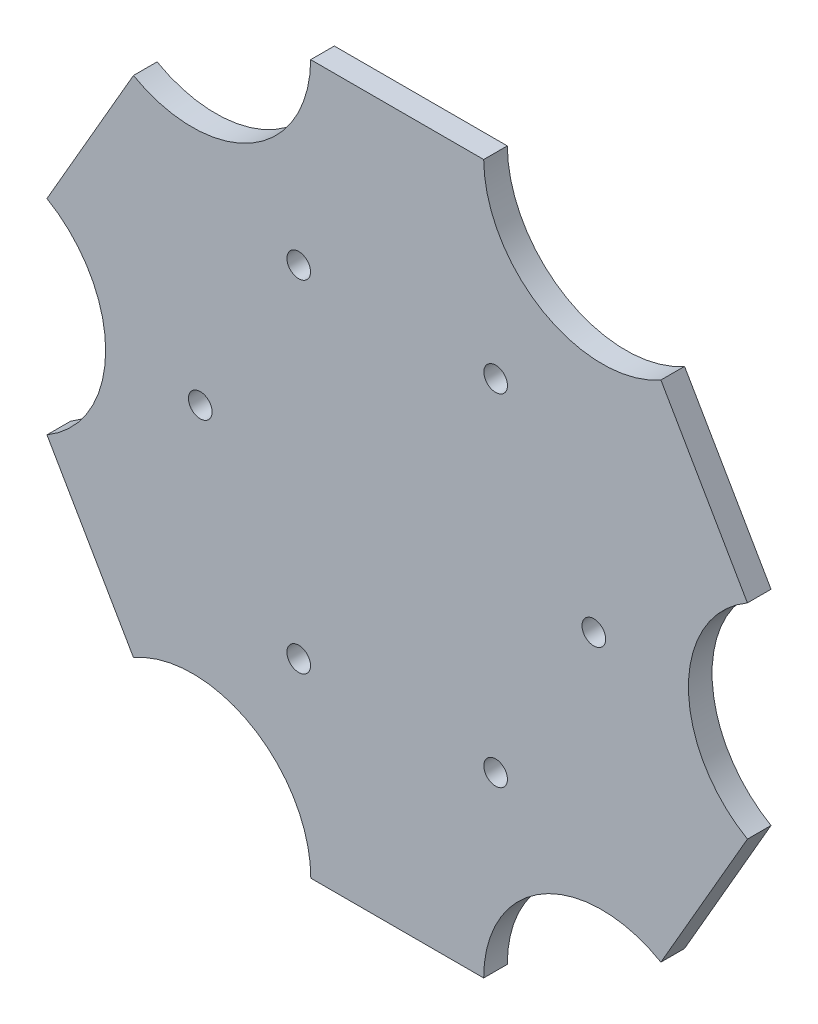
ISO-10303-21;
HEADER;
FILE_DESCRIPTION(('STEP AP214'),'2;1');
FILE_NAME('part.step','',(''),(''),'','','');
FILE_SCHEMA(('AUTOMOTIVE_DESIGN { 1 0 10303 214 1 1 1 1 }'));
ENDSEC;
DATA;
#1=APPLICATION_CONTEXT('core data for automotive mechanical design processes');
#2=APPLICATION_PROTOCOL_DEFINITION('international standard','automotive_design',2000,#1);
#3=PRODUCT_CONTEXT('',#1,'mechanical');
#4=PRODUCT('Part','Part','',(#3));
#5=PRODUCT_RELATED_PRODUCT_CATEGORY('part','',(#4));
#6=PRODUCT_DEFINITION_FORMATION('','',#4);
#7=PRODUCT_DEFINITION_CONTEXT('part definition',#1,'design');
#8=PRODUCT_DEFINITION('design','',#6,#7);
#9=PRODUCT_DEFINITION_SHAPE('','',#8);
#10=(LENGTH_UNIT() NAMED_UNIT(*) SI_UNIT(.MILLI.,.METRE.));
#11=(NAMED_UNIT(*) PLANE_ANGLE_UNIT() SI_UNIT($,.RADIAN.));
#12=(NAMED_UNIT(*) SI_UNIT($,.STERADIAN.) SOLID_ANGLE_UNIT());
#13=UNCERTAINTY_MEASURE_WITH_UNIT(LENGTH_MEASURE(1.E-05),#10,'distance_accuracy_value','');
#14=(GEOMETRIC_REPRESENTATION_CONTEXT(3) GLOBAL_UNCERTAINTY_ASSIGNED_CONTEXT((#13)) GLOBAL_UNIT_ASSIGNED_CONTEXT((#10,
#11,#12)) REPRESENTATION_CONTEXT('',''));
#15=CARTESIAN_POINT('',(0.,0.,0.));
#16=DIRECTION('',(0.,0.,1.));
#17=DIRECTION('',(1.,0.,0.));
#18=AXIS2_PLACEMENT_3D('',#15,#16,#17);
#19=CARTESIAN_POINT('',(119.979580325356,0.114436333170914,3.));
#20=DIRECTION('',(0.,0.,1.));
#21=DIRECTION('',(1.,0.,0.));
#22=AXIS2_PLACEMENT_3D('',#19,#20,#21);
#23=PLANE('',#22);
#24=CARTESIAN_POINT('',(158.518959172568,-66.6257666578341,3.));
#25=DIRECTION('',(0.,0.,1.));
#26=DIRECTION('',(1.,0.,0.));
#27=AXIS2_PLACEMENT_3D('',#24,#25,#26);
#28=CIRCLE('',#27,1.5);
#29=CARTESIAN_POINT('',(160.018959172568,-66.6257666578341,3.));
#30=VERTEX_POINT('',#29);
#31=EDGE_CURVE('E299',#30,#30,#28,.T.);
#32=ORIENTED_EDGE('',*,*,#31,.F.);
#33=EDGE_LOOP('',(#32));
#34=FACE_BOUND('',#33,.T.);
#35=CARTESIAN_POINT('',(170.981637028242,-44.9807610495307,3.));
#36=DIRECTION('',(0.,0.,1.));
#37=DIRECTION('',(1.,0.,0.));
#38=AXIS2_PLACEMENT_3D('',#35,#36,#37);
#39=CIRCLE('',#38,1.5);
#40=CARTESIAN_POINT('',(172.481637028242,-44.9807610495307,3.));
#41=VERTEX_POINT('',#40);
#42=EDGE_CURVE('E311',#41,#41,#39,.T.);
#43=ORIENTED_EDGE('',*,*,#42,.F.);
#44=EDGE_LOOP('',(#43));
#45=FACE_BOUND('',#44,.T.);
#46=CARTESIAN_POINT('',(133.517432281551,-23.3338121478623,3.));
#47=DIRECTION('',(0.,0.,1.));
#48=DIRECTION('',(1.,0.,0.));
#49=AXIS2_PLACEMENT_3D('',#46,#47,#48);
#50=CIRCLE('',#49,1.5);
#51=CARTESIAN_POINT('',(135.017432281551,-23.3338121478623,3.));
#52=VERTEX_POINT('',#51);
#53=EDGE_CURVE('E158',#52,#52,#50,.T.);
#54=ORIENTED_EDGE('',*,*,#53,.F.);
#55=EDGE_LOOP('',(#54));
#56=FACE_BOUND('',#55,.T.);
#57=CARTESIAN_POINT('',(119.979580325356,0.114436333170914,3.));
#58=DIRECTION('',(0.,0.,-1.));
#59=DIRECTION('',(1.,0.,0.));
#60=AXIS2_PLACEMENT_3D('',#57,#58,#59);
#61=CIRCLE('',#60,15.05818625931);
#62=CARTESIAN_POINT('',(135.037433185765,0.0142332676410922,3.));
#63=VERTEX_POINT('',#62);
#64=CARTESIAN_POINT('',(112.537432291695,-12.9761483010292,3.));
#65=VERTEX_POINT('',#64);
#66=EDGE_CURVE('E177',#63,#65,#61,.T.);
#67=ORIENTED_EDGE('',*,*,#66,.T.);
#68=DIRECTION('',(-0.5,-0.866025403784438,0.));
#69=VECTOR('',#68,1.);
#70=CARTESIAN_POINT('',(112.537432291695,-12.9761483010292,3.));
#71=LINE('',#70,#69);
#72=CARTESIAN_POINT('',(101.556669740257,-31.9953869459709,3.));
#73=VERTEX_POINT('',#72);
#74=EDGE_CURVE('E105',#65,#73,#71,.T.);
#75=ORIENTED_EDGE('',*,*,#74,.T.);
#76=CARTESIAN_POINT('',(93.9589217094331,-44.9857666519579,3.));
#77=DIRECTION('',(0.,0.,-1.));
#78=DIRECTION('',(-1.,0.,0.));
#79=AXIS2_PLACEMENT_3D('',#76,#77,#78);
#80=CIRCLE('',#79,15.04911093871);
#81=CARTESIAN_POINT('',(101.556669730112,-57.9761463638782,3.));
#82=VERTEX_POINT('',#81);
#83=EDGE_CURVE('E204',#73,#82,#80,.T.);
#84=ORIENTED_EDGE('',*,*,#83,.T.);
#85=DIRECTION('',(0.500518013777566,-0.865726121752232,0.));
#86=VECTOR('',#85,1.);
#87=CARTESIAN_POINT('',(112.54362772633,-76.9798510739908,3.));
#88=LINE('',#87,#86);
#89=CARTESIAN_POINT('',(112.54362772633,-76.9798510739908,3.));
#90=VERTEX_POINT('',#89);
#91=EDGE_CURVE('E223',#82,#90,#88,.T.);
#92=ORIENTED_EDGE('',*,*,#91,.T.);
#93=CARTESIAN_POINT('',(120.051394856653,-89.9657492694749,3.));
#94=DIRECTION('',(0.,0.,-1.));
#95=DIRECTION('',(-1.,0.,0.));
#96=AXIS2_PLACEMENT_3D('',#93,#94,#95);
#97=CIRCLE('',#96,15.0000039742205);
#98=CARTESIAN_POINT('',(135.051396662191,-89.9738152770584,3.));
#99=VERTEX_POINT('',#98);
#100=EDGE_CURVE('E220',#90,#99,#97,.T.);
#101=ORIENTED_EDGE('',*,*,#100,.T.);
#102=DIRECTION('',(1.,0.,0.));
#103=VECTOR('',#102,1.);
#104=CARTESIAN_POINT('',(156.998958278498,-89.9738152770582,3.));
#105=LINE('',#104,#103);
#106=CARTESIAN_POINT('',(156.998958278498,-89.9738152770582,3.));
#107=VERTEX_POINT('',#106);
#108=EDGE_CURVE('E222',#99,#107,#105,.T.);
#109=ORIENTED_EDGE('',*,*,#108,.T.);
#110=CARTESIAN_POINT('',(171.990199578125,-89.9586400139642,3.));
#111=DIRECTION('',(0.,0.,-1.));
#112=DIRECTION('',(-1.,0.,0.));
#113=AXIS2_PLACEMENT_3D('',#110,#111,#112);
#114=CIRCLE('',#113,14.9912489803965);
#115=CARTESIAN_POINT('',(179.498959172568,-76.9834299830978,3.));
#116=VERTEX_POINT('',#115);
#117=EDGE_CURVE('E225',#107,#116,#114,.T.);
#118=ORIENTED_EDGE('',*,*,#117,.T.);
#119=DIRECTION('',(0.50000007298917,0.866025361644118,0.));
#120=VECTOR('',#119,1.);
#121=CARTESIAN_POINT('',(190.479721713862,-57.9641950575893,3.));
#122=LINE('',#121,#120);
#123=CARTESIAN_POINT('',(190.479721713862,-57.9641950575893,3.));
#124=VERTEX_POINT('',#123);
#125=EDGE_CURVE('E231',#116,#124,#122,.T.);
#126=ORIENTED_EDGE('',*,*,#125,.T.);
#127=CARTESIAN_POINT('',(197.993214147128,-44.9797910017801,3.));
#128=DIRECTION('',(0.,0.,-1.));
#129=DIRECTION('',(1.,0.,0.));
#130=AXIS2_PLACEMENT_3D('',#127,#128,#129);
#131=CIRCLE('',#130,15.0015771580614);
#132=CARTESIAN_POINT('',(190.479721713862,-31.9953869459709,3.));
#133=VERTEX_POINT('',#132);
#134=EDGE_CURVE('E136',#124,#133,#131,.T.);
#135=ORIENTED_EDGE('',*,*,#134,.T.);
#136=DIRECTION('',(-0.499999999999997,0.86602540378444,0.));
#137=VECTOR('',#136,1.);
#138=CARTESIAN_POINT('',(179.498959162423,-12.9761483010292,3.));
#139=LINE('',#138,#137);
#140=CARTESIAN_POINT('',(179.498959162423,-12.9761483010292,3.));
#141=VERTEX_POINT('',#140);
#142=EDGE_CURVE('E130',#133,#141,#139,.T.);
#143=ORIENTED_EDGE('',*,*,#142,.T.);
#144=CARTESIAN_POINT('',(172.056811137118,0.114436347643693,3.));
#145=DIRECTION('',(0.,0.,-1.));
#146=DIRECTION('',(1.,0.,0.));
#147=AXIS2_PLACEMENT_3D('',#144,#145,#146);
#148=CIRCLE('',#147,15.058186267762);
#149=CARTESIAN_POINT('',(156.998958268353,0.0142332676410987,3.));
#150=VERTEX_POINT('',#149);
#151=EDGE_CURVE('E134',#141,#150,#148,.T.);
#152=ORIENTED_EDGE('',*,*,#151,.T.);
#153=DIRECTION('',(-1.,0.,0.));
#154=VECTOR('',#153,1.);
#155=CARTESIAN_POINT('',(135.037433185765,0.0142332676410922,3.));
#156=LINE('',#155,#154);
#157=EDGE_CURVE('E50',#150,#63,#156,.T.);
#158=ORIENTED_EDGE('',*,*,#157,.T.);
#159=EDGE_LOOP('',(#67,#75,#84,#92,#101,#109,#118,#126,#135,#143,#152,#158));
#160=FACE_BOUND('',#159,.T.);
#161=CARTESIAN_POINT('',(158.518959172568,-23.3338121478623,3.));
#162=DIRECTION('',(0.,0.,1.));
#163=DIRECTION('',(1.,0.,0.));
#164=AXIS2_PLACEMENT_3D('',#161,#162,#163);
#165=CIRCLE('',#164,1.5);
#166=CARTESIAN_POINT('',(160.018959172568,-23.3338121478623,3.));
#167=VERTEX_POINT('',#166);
#168=EDGE_CURVE('E317',#167,#167,#165,.T.);
#169=ORIENTED_EDGE('',*,*,#168,.F.);
#170=EDGE_LOOP('',(#169));
#171=FACE_BOUND('',#170,.T.);
#172=CARTESIAN_POINT('',(121.018032608968,-44.9847966100835,3.));
#173=DIRECTION('',(0.,0.,1.));
#174=DIRECTION('',(1.,0.,0.));
#175=AXIS2_PLACEMENT_3D('',#172,#173,#174);
#176=CIRCLE('',#175,1.5);
#177=CARTESIAN_POINT('',(122.518032608968,-44.9847966100835,3.));
#178=VERTEX_POINT('',#177);
#179=EDGE_CURVE('E305',#178,#178,#176,.T.);
#180=ORIENTED_EDGE('',*,*,#179,.F.);
#181=EDGE_LOOP('',(#180));
#182=FACE_BOUND('',#181,.T.);
#183=CARTESIAN_POINT('',(133.517432281551,-66.6257666578341,3.));
#184=DIRECTION('',(0.,0.,1.));
#185=DIRECTION('',(1.,0.,0.));
#186=AXIS2_PLACEMENT_3D('',#183,#184,#185);
#187=CIRCLE('',#186,1.5);
#188=CARTESIAN_POINT('',(135.017432281551,-66.6257666578341,3.));
#189=VERTEX_POINT('',#188);
#190=EDGE_CURVE('E290',#189,#189,#187,.T.);
#191=ORIENTED_EDGE('',*,*,#190,.F.);
#192=EDGE_LOOP('',(#191));
#193=FACE_BOUND('',#192,.T.);
#194=ADVANCED_FACE('F33',(#34,#45,#56,#160,#171,#182,#193),#23,.T.);
#195=CARTESIAN_POINT('',(119.979580325356,0.114436333170914,0.));
#196=DIRECTION('',(0.,0.,1.));
#197=DIRECTION('',(1.,0.,0.));
#198=AXIS2_PLACEMENT_3D('',#195,#196,#197);
#199=PLANE('',#198);
#200=CARTESIAN_POINT('',(119.979580325356,0.114436333170914,0.));
#201=DIRECTION('',(0.,0.,-1.));
#202=DIRECTION('',(1.,0.,0.));
#203=AXIS2_PLACEMENT_3D('',#200,#201,#202);
#204=CIRCLE('',#203,15.05818625931);
#205=CARTESIAN_POINT('',(135.037433185765,0.0142332676410922,0.));
#206=VERTEX_POINT('',#205);
#207=CARTESIAN_POINT('',(112.537432291695,-12.9761483010292,0.));
#208=VERTEX_POINT('',#207);
#209=EDGE_CURVE('E154',#206,#208,#204,.T.);
#210=ORIENTED_EDGE('',*,*,#209,.F.);
#211=DIRECTION('',(-1.,0.,0.));
#212=VECTOR('',#211,1.);
#213=CARTESIAN_POINT('',(135.037433185765,0.0142332676410922,0.));
#214=LINE('',#213,#212);
#215=CARTESIAN_POINT('',(156.998958268353,0.0142332676410987,0.));
#216=VERTEX_POINT('',#215);
#217=EDGE_CURVE('E97',#216,#206,#214,.T.);
#218=ORIENTED_EDGE('',*,*,#217,.F.);
#219=CARTESIAN_POINT('',(172.056811137118,0.114436347643693,0.));
#220=DIRECTION('',(0.,0.,-1.));
#221=DIRECTION('',(1.,0.,0.));
#222=AXIS2_PLACEMENT_3D('',#219,#220,#221);
#223=CIRCLE('',#222,15.058186267762);
#224=CARTESIAN_POINT('',(179.498959162423,-12.9761483010292,0.));
#225=VERTEX_POINT('',#224);
#226=EDGE_CURVE('E91',#225,#216,#223,.T.);
#227=ORIENTED_EDGE('',*,*,#226,.F.);
#228=DIRECTION('',(-0.499999999999997,0.86602540378444,0.));
#229=VECTOR('',#228,1.);
#230=CARTESIAN_POINT('',(179.498959162423,-12.9761483010292,0.));
#231=LINE('',#230,#229);
#232=CARTESIAN_POINT('',(190.479721713862,-31.9953869459709,0.));
#233=VERTEX_POINT('',#232);
#234=EDGE_CURVE('E144',#233,#225,#231,.T.);
#235=ORIENTED_EDGE('',*,*,#234,.F.);
#236=CARTESIAN_POINT('',(197.993214147128,-44.9797910017801,0.));
#237=DIRECTION('',(0.,0.,-1.));
#238=DIRECTION('',(1.,0.,0.));
#239=AXIS2_PLACEMENT_3D('',#236,#237,#238);
#240=CIRCLE('',#239,15.0015771580614);
#241=CARTESIAN_POINT('',(190.479721713862,-57.9641950575893,0.));
#242=VERTEX_POINT('',#241);
#243=EDGE_CURVE('E172',#242,#233,#240,.T.);
#244=ORIENTED_EDGE('',*,*,#243,.F.);
#245=DIRECTION('',(0.50000007298917,0.866025361644118,0.));
#246=VECTOR('',#245,1.);
#247=CARTESIAN_POINT('',(190.479721713862,-57.9641950575893,0.));
#248=LINE('',#247,#246);
#249=CARTESIAN_POINT('',(179.498959172568,-76.9834299830978,0.));
#250=VERTEX_POINT('',#249);
#251=EDGE_CURVE('E170',#250,#242,#248,.T.);
#252=ORIENTED_EDGE('',*,*,#251,.F.);
#253=CARTESIAN_POINT('',(171.990199578125,-89.9586400139642,0.));
#254=DIRECTION('',(0.,0.,-1.));
#255=DIRECTION('',(-1.,0.,0.));
#256=AXIS2_PLACEMENT_3D('',#253,#254,#255);
#257=CIRCLE('',#256,14.9912489803965);
#258=CARTESIAN_POINT('',(156.998958278498,-89.9738152770582,0.));
#259=VERTEX_POINT('',#258);
#260=EDGE_CURVE('E168',#259,#250,#257,.T.);
#261=ORIENTED_EDGE('',*,*,#260,.F.);
#262=DIRECTION('',(1.,0.,0.));
#263=VECTOR('',#262,1.);
#264=CARTESIAN_POINT('',(156.998958278498,-89.9738152770582,0.));
#265=LINE('',#264,#263);
#266=CARTESIAN_POINT('',(135.051396662191,-89.9738152770584,0.));
#267=VERTEX_POINT('',#266);
#268=EDGE_CURVE('E166',#267,#259,#265,.T.);
#269=ORIENTED_EDGE('',*,*,#268,.F.);
#270=CARTESIAN_POINT('',(120.051394856653,-89.9657492694749,0.));
#271=DIRECTION('',(0.,0.,-1.));
#272=DIRECTION('',(-1.,0.,0.));
#273=AXIS2_PLACEMENT_3D('',#270,#271,#272);
#274=CIRCLE('',#273,15.0000039742205);
#275=CARTESIAN_POINT('',(112.54362772633,-76.9798510739908,0.));
#276=VERTEX_POINT('',#275);
#277=EDGE_CURVE('E164',#276,#267,#274,.T.);
#278=ORIENTED_EDGE('',*,*,#277,.F.);
#279=DIRECTION('',(0.500518013777566,-0.865726121752232,0.));
#280=VECTOR('',#279,1.);
#281=CARTESIAN_POINT('',(112.54362772633,-76.9798510739908,0.));
#282=LINE('',#281,#280);
#283=CARTESIAN_POINT('',(101.556669730112,-57.9761463638782,0.));
#284=VERTEX_POINT('',#283);
#285=EDGE_CURVE('E162',#284,#276,#282,.T.);
#286=ORIENTED_EDGE('',*,*,#285,.F.);
#287=CARTESIAN_POINT('',(93.9589217094331,-44.9857666519579,0.));
#288=DIRECTION('',(0.,0.,-1.));
#289=DIRECTION('',(-1.,0.,0.));
#290=AXIS2_PLACEMENT_3D('',#287,#288,#289);
#291=CIRCLE('',#290,15.04911093871);
#292=CARTESIAN_POINT('',(101.556669740257,-31.9953869459709,0.));
#293=VERTEX_POINT('',#292);
#294=EDGE_CURVE('E160',#293,#284,#291,.T.);
#295=ORIENTED_EDGE('',*,*,#294,.F.);
#296=DIRECTION('',(-0.5,-0.866025403784438,0.));
#297=VECTOR('',#296,1.);
#298=CARTESIAN_POINT('',(112.537432291695,-12.9761483010292,0.));
#299=LINE('',#298,#297);
#300=EDGE_CURVE('E157',#208,#293,#299,.T.);
#301=ORIENTED_EDGE('',*,*,#300,.F.);
#302=EDGE_LOOP('',(#210,#218,#227,#235,#244,#252,#261,#269,#278,#286,#295,#301));
#303=FACE_BOUND('',#302,.T.);
#304=CARTESIAN_POINT('',(133.517432281551,-23.3338121478623,0.));
#305=DIRECTION('',(0.,0.,1.));
#306=DIRECTION('',(1.,0.,0.));
#307=AXIS2_PLACEMENT_3D('',#304,#305,#306);
#308=CIRCLE('',#307,1.5);
#309=CARTESIAN_POINT('',(135.017432281551,-23.3338121478623,0.));
#310=VERTEX_POINT('',#309);
#311=EDGE_CURVE('E320',#310,#310,#308,.T.);
#312=ORIENTED_EDGE('',*,*,#311,.T.);
#313=EDGE_LOOP('',(#312));
#314=FACE_BOUND('',#313,.T.);
#315=CARTESIAN_POINT('',(158.518959172568,-23.3338121478623,0.));
#316=DIRECTION('',(0.,0.,1.));
#317=DIRECTION('',(1.,0.,0.));
#318=AXIS2_PLACEMENT_3D('',#315,#316,#317);
#319=CIRCLE('',#318,1.5);
#320=CARTESIAN_POINT('',(160.018959172568,-23.3338121478623,0.));
#321=VERTEX_POINT('',#320);
#322=EDGE_CURVE('E314',#321,#321,#319,.T.);
#323=ORIENTED_EDGE('',*,*,#322,.T.);
#324=EDGE_LOOP('',(#323));
#325=FACE_BOUND('',#324,.T.);
#326=CARTESIAN_POINT('',(170.981637028242,-44.9807610495307,0.));
#327=DIRECTION('',(0.,0.,1.));
#328=DIRECTION('',(1.,0.,0.));
#329=AXIS2_PLACEMENT_3D('',#326,#327,#328);
#330=CIRCLE('',#329,1.5);
#331=CARTESIAN_POINT('',(172.481637028242,-44.9807610495307,0.));
#332=VERTEX_POINT('',#331);
#333=EDGE_CURVE('E308',#332,#332,#330,.T.);
#334=ORIENTED_EDGE('',*,*,#333,.T.);
#335=EDGE_LOOP('',(#334));
#336=FACE_BOUND('',#335,.T.);
#337=CARTESIAN_POINT('',(121.018032608968,-44.9847966100835,0.));
#338=DIRECTION('',(0.,0.,1.));
#339=DIRECTION('',(1.,0.,0.));
#340=AXIS2_PLACEMENT_3D('',#337,#338,#339);
#341=CIRCLE('',#340,1.5);
#342=CARTESIAN_POINT('',(122.518032608968,-44.9847966100835,0.));
#343=VERTEX_POINT('',#342);
#344=EDGE_CURVE('E302',#343,#343,#341,.T.);
#345=ORIENTED_EDGE('',*,*,#344,.T.);
#346=EDGE_LOOP('',(#345));
#347=FACE_BOUND('',#346,.T.);
#348=CARTESIAN_POINT('',(158.518959172568,-66.6257666578341,0.));
#349=DIRECTION('',(0.,0.,1.));
#350=DIRECTION('',(1.,0.,0.));
#351=AXIS2_PLACEMENT_3D('',#348,#349,#350);
#352=CIRCLE('',#351,1.5);
#353=CARTESIAN_POINT('',(160.018959172568,-66.6257666578341,0.));
#354=VERTEX_POINT('',#353);
#355=EDGE_CURVE('E296',#354,#354,#352,.T.);
#356=ORIENTED_EDGE('',*,*,#355,.T.);
#357=EDGE_LOOP('',(#356));
#358=FACE_BOUND('',#357,.T.);
#359=CARTESIAN_POINT('',(133.517432281551,-66.6257666578341,0.));
#360=DIRECTION('',(0.,0.,1.));
#361=DIRECTION('',(1.,0.,0.));
#362=AXIS2_PLACEMENT_3D('',#359,#360,#361);
#363=CIRCLE('',#362,1.5);
#364=CARTESIAN_POINT('',(135.017432281551,-66.6257666578341,0.));
#365=VERTEX_POINT('',#364);
#366=EDGE_CURVE('E293',#365,#365,#363,.T.);
#367=ORIENTED_EDGE('',*,*,#366,.T.);
#368=EDGE_LOOP('',(#367));
#369=FACE_BOUND('',#368,.T.);
#370=ADVANCED_FACE('F208',(#303,#314,#325,#336,#347,#358,#369),#199,.F.);
#371=CARTESIAN_POINT('',(119.979580325356,0.114436333170914,3.));
#372=DIRECTION('',(0.,0.,-1.));
#373=DIRECTION('',(-1.,0.,0.));
#374=AXIS2_PLACEMENT_3D('',#371,#372,#373);
#375=CYLINDRICAL_SURFACE('',#374,15.05818625931);
#376=ORIENTED_EDGE('',*,*,#209,.T.);
#377=DIRECTION('',(0.,0.,-1.));
#378=VECTOR('',#377,1.);
#379=CARTESIAN_POINT('',(112.537432291695,-12.9761483010292,3.));
#380=LINE('',#379,#378);
#381=EDGE_CURVE('E11',#65,#208,#380,.T.);
#382=ORIENTED_EDGE('',*,*,#381,.F.);
#383=ORIENTED_EDGE('',*,*,#66,.F.);
#384=DIRECTION('',(0.,0.,-1.));
#385=VECTOR('',#384,1.);
#386=CARTESIAN_POINT('',(135.037433185765,0.0142332676410922,3.));
#387=LINE('',#386,#385);
#388=EDGE_CURVE('E150',#63,#206,#387,.T.);
#389=ORIENTED_EDGE('',*,*,#388,.T.);
#390=EDGE_LOOP('',(#376,#382,#383,#389));
#391=FACE_BOUND('',#390,.T.);
#392=ADVANCED_FACE('F35',(#391),#375,.F.);
#393=CARTESIAN_POINT('',(112.537432291695,-12.9761483010292,3.));
#394=DIRECTION('',(0.866025403784439,-0.5,0.));
#395=DIRECTION('',(0.5,0.866025403784439,0.));
#396=AXIS2_PLACEMENT_3D('',#393,#394,#395);
#397=PLANE('',#396);
#398=ORIENTED_EDGE('',*,*,#300,.T.);
#399=DIRECTION('',(0.,0.,-1.));
#400=VECTOR('',#399,1.);
#401=CARTESIAN_POINT('',(101.556669740257,-31.9953869459709,3.));
#402=LINE('',#401,#400);
#403=EDGE_CURVE('E42',#73,#293,#402,.T.);
#404=ORIENTED_EDGE('',*,*,#403,.F.);
#405=ORIENTED_EDGE('',*,*,#74,.F.);
#406=ORIENTED_EDGE('',*,*,#381,.T.);
#407=EDGE_LOOP('',(#398,#404,#405,#406));
#408=FACE_BOUND('',#407,.T.);
#409=ADVANCED_FACE('F448',(#408),#397,.F.);
#410=CARTESIAN_POINT('',(93.9589217094331,-44.9857666519579,3.));
#411=DIRECTION('',(0.,0.,-1.));
#412=DIRECTION('',(-1.,0.,0.));
#413=AXIS2_PLACEMENT_3D('',#410,#411,#412);
#414=CYLINDRICAL_SURFACE('',#413,15.04911093871);
#415=ORIENTED_EDGE('',*,*,#294,.T.);
#416=DIRECTION('',(0.,0.,-1.));
#417=VECTOR('',#416,1.);
#418=CARTESIAN_POINT('',(101.556669730112,-57.9761463638782,3.));
#419=LINE('',#418,#417);
#420=EDGE_CURVE('E196',#82,#284,#419,.T.);
#421=ORIENTED_EDGE('',*,*,#420,.F.);
#422=ORIENTED_EDGE('',*,*,#83,.F.);
#423=ORIENTED_EDGE('',*,*,#403,.T.);
#424=EDGE_LOOP('',(#415,#421,#422,#423));
#425=FACE_BOUND('',#424,.T.);
#426=ADVANCED_FACE('F202',(#425),#414,.F.);
#427=CARTESIAN_POINT('',(112.54362772633,-76.9798510739908,3.));
#428=DIRECTION('',(0.865726121752232,0.500518013777566,0.));
#429=DIRECTION('',(-0.500518013777566,0.865726121752232,0.));
#430=AXIS2_PLACEMENT_3D('',#427,#428,#429);
#431=PLANE('',#430);
#432=ORIENTED_EDGE('',*,*,#285,.T.);
#433=DIRECTION('',(0.,0.,-1.));
#434=VECTOR('',#433,1.);
#435=CARTESIAN_POINT('',(112.54362772633,-76.9798510739908,3.));
#436=LINE('',#435,#434);
#437=EDGE_CURVE('E193',#90,#276,#436,.T.);
#438=ORIENTED_EDGE('',*,*,#437,.F.);
#439=ORIENTED_EDGE('',*,*,#91,.F.);
#440=ORIENTED_EDGE('',*,*,#420,.T.);
#441=EDGE_LOOP('',(#432,#438,#439,#440));
#442=FACE_BOUND('',#441,.T.);
#443=ADVANCED_FACE('F214',(#442),#431,.F.);
#444=CARTESIAN_POINT('',(120.051394856653,-89.9657492694749,3.));
#445=DIRECTION('',(0.,0.,-1.));
#446=DIRECTION('',(-1.,0.,0.));
#447=AXIS2_PLACEMENT_3D('',#444,#445,#446);
#448=CYLINDRICAL_SURFACE('',#447,15.0000039742205);
#449=ORIENTED_EDGE('',*,*,#277,.T.);
#450=DIRECTION('',(0.,0.,-1.));
#451=VECTOR('',#450,1.);
#452=CARTESIAN_POINT('',(135.051396662191,-89.9738152770584,3.));
#453=LINE('',#452,#451);
#454=EDGE_CURVE('E190',#99,#267,#453,.T.);
#455=ORIENTED_EDGE('',*,*,#454,.F.);
#456=ORIENTED_EDGE('',*,*,#100,.F.);
#457=ORIENTED_EDGE('',*,*,#437,.T.);
#458=EDGE_LOOP('',(#449,#455,#456,#457));
#459=FACE_BOUND('',#458,.T.);
#460=ADVANCED_FACE('F218',(#459),#448,.F.);
#461=CARTESIAN_POINT('',(156.998958278498,-89.9738152770582,3.));
#462=DIRECTION('',(0.,1.,0.));
#463=DIRECTION('',(-1.,0.,0.));
#464=AXIS2_PLACEMENT_3D('',#461,#462,#463);
#465=PLANE('',#464);
#466=ORIENTED_EDGE('',*,*,#268,.T.);
#467=DIRECTION('',(0.,0.,-1.));
#468=VECTOR('',#467,1.);
#469=CARTESIAN_POINT('',(156.998958278498,-89.9738152770582,3.));
#470=LINE('',#469,#468);
#471=EDGE_CURVE('E187',#107,#259,#470,.T.);
#472=ORIENTED_EDGE('',*,*,#471,.F.);
#473=ORIENTED_EDGE('',*,*,#108,.F.);
#474=ORIENTED_EDGE('',*,*,#454,.T.);
#475=EDGE_LOOP('',(#466,#472,#473,#474));
#476=FACE_BOUND('',#475,.T.);
#477=ADVANCED_FACE('F413',(#476),#465,.F.);
#478=CARTESIAN_POINT('',(171.990199578125,-89.9586400139642,3.));
#479=DIRECTION('',(0.,0.,-1.));
#480=DIRECTION('',(-1.,0.,0.));
#481=AXIS2_PLACEMENT_3D('',#478,#479,#480);
#482=CYLINDRICAL_SURFACE('',#481,14.9912489803965);
#483=ORIENTED_EDGE('',*,*,#260,.T.);
#484=DIRECTION('',(0.,0.,-1.));
#485=VECTOR('',#484,1.);
#486=CARTESIAN_POINT('',(179.498959172568,-76.9834299830978,3.));
#487=LINE('',#486,#485);
#488=EDGE_CURVE('E184',#116,#250,#487,.T.);
#489=ORIENTED_EDGE('',*,*,#488,.F.);
#490=ORIENTED_EDGE('',*,*,#117,.F.);
#491=ORIENTED_EDGE('',*,*,#471,.T.);
#492=EDGE_LOOP('',(#483,#489,#490,#491));
#493=FACE_BOUND('',#492,.T.);
#494=ADVANCED_FACE('F404',(#493),#482,.F.);
#495=CARTESIAN_POINT('',(190.479721713862,-57.9641950575893,3.));
#496=DIRECTION('',(-0.866025361644118,0.50000007298917,0.));
#497=DIRECTION('',(-0.50000007298917,-0.866025361644118,0.));
#498=AXIS2_PLACEMENT_3D('',#495,#496,#497);
#499=PLANE('',#498);
#500=ORIENTED_EDGE('',*,*,#251,.T.);
#501=DIRECTION('',(0.,0.,-1.));
#502=VECTOR('',#501,1.);
#503=CARTESIAN_POINT('',(190.479721713862,-57.9641950575893,3.));
#504=LINE('',#503,#502);
#505=EDGE_CURVE('E181',#124,#242,#504,.T.);
#506=ORIENTED_EDGE('',*,*,#505,.F.);
#507=ORIENTED_EDGE('',*,*,#125,.F.);
#508=ORIENTED_EDGE('',*,*,#488,.T.);
#509=EDGE_LOOP('',(#500,#506,#507,#508));
#510=FACE_BOUND('',#509,.T.);
#511=ADVANCED_FACE('F237',(#510),#499,.F.);
#512=CARTESIAN_POINT('',(197.993214147128,-44.9797910017801,3.));
#513=DIRECTION('',(0.,0.,-1.));
#514=DIRECTION('',(-1.,0.,0.));
#515=AXIS2_PLACEMENT_3D('',#512,#513,#514);
#516=CYLINDRICAL_SURFACE('',#515,15.0015771580614);
#517=ORIENTED_EDGE('',*,*,#243,.T.);
#518=DIRECTION('',(0.,0.,-1.));
#519=VECTOR('',#518,1.);
#520=CARTESIAN_POINT('',(190.479721713862,-31.9953869459709,3.));
#521=LINE('',#520,#519);
#522=EDGE_CURVE('E145',#133,#233,#521,.T.);
#523=ORIENTED_EDGE('',*,*,#522,.F.);
#524=ORIENTED_EDGE('',*,*,#134,.F.);
#525=ORIENTED_EDGE('',*,*,#505,.T.);
#526=EDGE_LOOP('',(#517,#523,#524,#525));
#527=FACE_BOUND('',#526,.T.);
#528=ADVANCED_FACE('F241',(#527),#516,.F.);
#529=CARTESIAN_POINT('',(179.498959162423,-12.9761483010292,3.));
#530=DIRECTION('',(-0.86602540378444,-0.499999999999997,0.));
#531=DIRECTION('',(0.499999999999997,-0.86602540378444,0.));
#532=AXIS2_PLACEMENT_3D('',#529,#530,#531);
#533=PLANE('',#532);
#534=ORIENTED_EDGE('',*,*,#234,.T.);
#535=DIRECTION('',(0.,0.,-1.));
#536=VECTOR('',#535,1.);
#537=CARTESIAN_POINT('',(179.498959162423,-12.9761483010292,3.));
#538=LINE('',#537,#536);
#539=EDGE_CURVE('E141',#141,#225,#538,.T.);
#540=ORIENTED_EDGE('',*,*,#539,.F.);
#541=ORIENTED_EDGE('',*,*,#142,.F.);
#542=ORIENTED_EDGE('',*,*,#522,.T.);
#543=EDGE_LOOP('',(#534,#540,#541,#542));
#544=FACE_BOUND('',#543,.T.);
#545=ADVANCED_FACE('F142',(#544),#533,.F.);
#546=CARTESIAN_POINT('',(172.056811137118,0.114436347643693,3.));
#547=DIRECTION('',(0.,0.,-1.));
#548=DIRECTION('',(-1.,0.,0.));
#549=AXIS2_PLACEMENT_3D('',#546,#547,#548);
#550=CYLINDRICAL_SURFACE('',#549,15.058186267762);
#551=ORIENTED_EDGE('',*,*,#226,.T.);
#552=DIRECTION('',(0.,0.,-1.));
#553=VECTOR('',#552,1.);
#554=CARTESIAN_POINT('',(156.998958268353,0.0142332676410987,3.));
#555=LINE('',#554,#553);
#556=EDGE_CURVE('E146',#150,#216,#555,.T.);
#557=ORIENTED_EDGE('',*,*,#556,.F.);
#558=ORIENTED_EDGE('',*,*,#151,.F.);
#559=ORIENTED_EDGE('',*,*,#539,.T.);
#560=EDGE_LOOP('',(#551,#557,#558,#559));
#561=FACE_BOUND('',#560,.T.);
#562=ADVANCED_FACE('F148',(#561),#550,.F.);
#563=CARTESIAN_POINT('',(135.037433185765,0.0142332676410922,3.));
#564=DIRECTION('',(0.,-1.,0.));
#565=DIRECTION('',(0.,0.,-1.));
#566=AXIS2_PLACEMENT_3D('',#563,#564,#565);
#567=PLANE('',#566);
#568=ORIENTED_EDGE('',*,*,#217,.T.);
#569=ORIENTED_EDGE('',*,*,#388,.F.);
#570=ORIENTED_EDGE('',*,*,#157,.F.);
#571=ORIENTED_EDGE('',*,*,#556,.T.);
#572=EDGE_LOOP('',(#568,#569,#570,#571));
#573=FACE_BOUND('',#572,.T.);
#574=ADVANCED_FACE('F245',(#573),#567,.F.);
#575=CARTESIAN_POINT('',(133.517432281551,-23.3338121478623,3.));
#576=DIRECTION('',(0.,0.,-1.));
#577=DIRECTION('',(-1.,0.,0.));
#578=AXIS2_PLACEMENT_3D('',#575,#576,#577);
#579=CYLINDRICAL_SURFACE('',#578,1.5);
#580=ORIENTED_EDGE('',*,*,#53,.T.);
#581=EDGE_LOOP('',(#580));
#582=FACE_BOUND('',#581,.T.);
#583=ORIENTED_EDGE('',*,*,#311,.F.);
#584=EDGE_LOOP('',(#583));
#585=FACE_BOUND('',#584,.T.);
#586=ADVANCED_FACE('F247',(#582,#585),#579,.F.);
#587=CARTESIAN_POINT('',(158.518959172568,-23.3338121478623,3.));
#588=DIRECTION('',(0.,0.,-1.));
#589=DIRECTION('',(-1.,0.,0.));
#590=AXIS2_PLACEMENT_3D('',#587,#588,#589);
#591=CYLINDRICAL_SURFACE('',#590,1.5);
#592=ORIENTED_EDGE('',*,*,#168,.T.);
#593=EDGE_LOOP('',(#592));
#594=FACE_BOUND('',#593,.T.);
#595=ORIENTED_EDGE('',*,*,#322,.F.);
#596=EDGE_LOOP('',(#595));
#597=FACE_BOUND('',#596,.T.);
#598=ADVANCED_FACE('F253',(#594,#597),#591,.F.);
#599=CARTESIAN_POINT('',(170.981637028242,-44.9807610495307,3.));
#600=DIRECTION('',(0.,0.,-1.));
#601=DIRECTION('',(-1.,0.,0.));
#602=AXIS2_PLACEMENT_3D('',#599,#600,#601);
#603=CYLINDRICAL_SURFACE('',#602,1.5);
#604=ORIENTED_EDGE('',*,*,#42,.T.);
#605=EDGE_LOOP('',(#604));
#606=FACE_BOUND('',#605,.T.);
#607=ORIENTED_EDGE('',*,*,#333,.F.);
#608=EDGE_LOOP('',(#607));
#609=FACE_BOUND('',#608,.T.);
#610=ADVANCED_FACE('F269',(#606,#609),#603,.F.);
#611=CARTESIAN_POINT('',(121.018032608968,-44.9847966100835,3.));
#612=DIRECTION('',(0.,0.,-1.));
#613=DIRECTION('',(-1.,0.,0.));
#614=AXIS2_PLACEMENT_3D('',#611,#612,#613);
#615=CYLINDRICAL_SURFACE('',#614,1.5);
#616=ORIENTED_EDGE('',*,*,#179,.T.);
#617=EDGE_LOOP('',(#616));
#618=FACE_BOUND('',#617,.T.);
#619=ORIENTED_EDGE('',*,*,#344,.F.);
#620=EDGE_LOOP('',(#619));
#621=FACE_BOUND('',#620,.T.);
#622=ADVANCED_FACE('F273',(#618,#621),#615,.F.);
#623=CARTESIAN_POINT('',(158.518959172568,-66.6257666578341,3.));
#624=DIRECTION('',(0.,0.,-1.));
#625=DIRECTION('',(-1.,0.,0.));
#626=AXIS2_PLACEMENT_3D('',#623,#624,#625);
#627=CYLINDRICAL_SURFACE('',#626,1.5);
#628=ORIENTED_EDGE('',*,*,#31,.T.);
#629=EDGE_LOOP('',(#628));
#630=FACE_BOUND('',#629,.T.);
#631=ORIENTED_EDGE('',*,*,#355,.F.);
#632=EDGE_LOOP('',(#631));
#633=FACE_BOUND('',#632,.T.);
#634=ADVANCED_FACE('F277',(#630,#633),#627,.F.);
#635=CARTESIAN_POINT('',(133.517432281551,-66.6257666578341,3.));
#636=DIRECTION('',(0.,0.,-1.));
#637=DIRECTION('',(-1.,0.,0.));
#638=AXIS2_PLACEMENT_3D('',#635,#636,#637);
#639=CYLINDRICAL_SURFACE('',#638,1.5);
#640=ORIENTED_EDGE('',*,*,#190,.T.);
#641=EDGE_LOOP('',(#640));
#642=FACE_BOUND('',#641,.T.);
#643=ORIENTED_EDGE('',*,*,#366,.F.);
#644=EDGE_LOOP('',(#643));
#645=FACE_BOUND('',#644,.T.);
#646=ADVANCED_FACE('F281',(#642,#645),#639,.F.);
#647=CLOSED_SHELL('',(#194,#370,#392,#409,#426,#443,#460,#477,#494,#511,#528,#545,#562,#574,
#586,#598,#610,#622,#634,#646));
#648=MANIFOLD_SOLID_BREP('B2',#647);
#649=ADVANCED_BREP_SHAPE_REPRESENTATION('',(#18,#648),#14);
#650=SHAPE_DEFINITION_REPRESENTATION(#9,#649);
ENDSEC;
END-ISO-10303-21;
